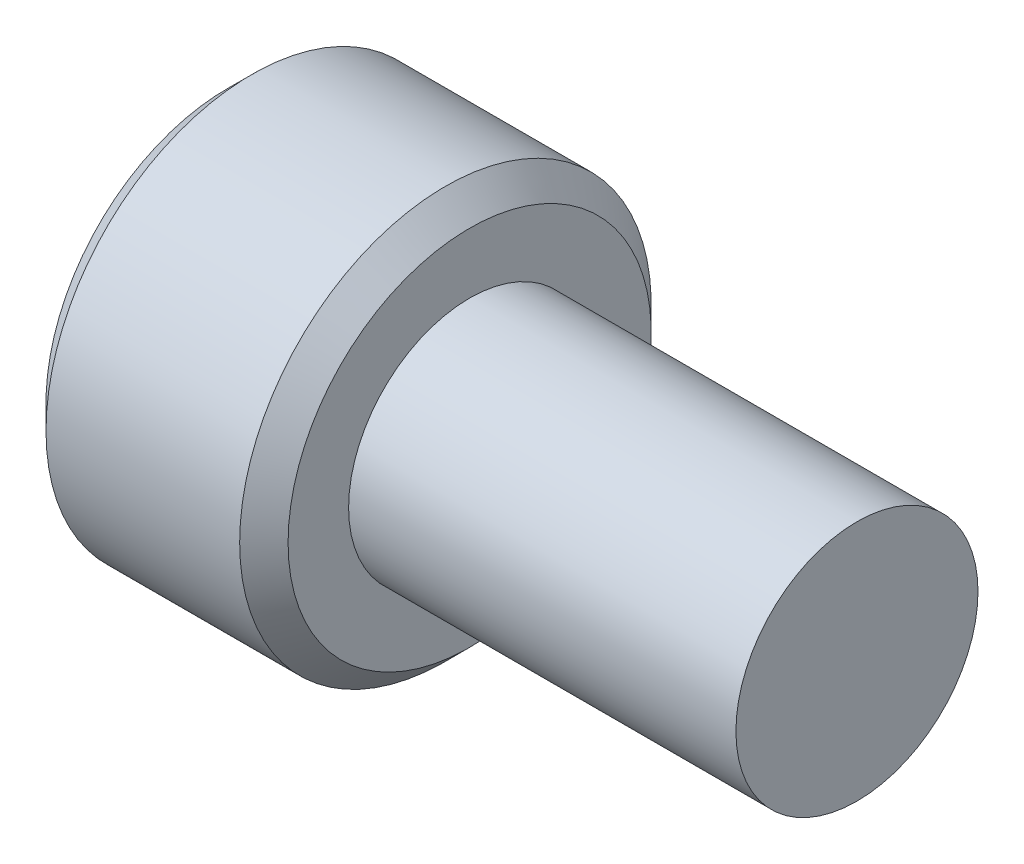
ISO-10303-21;
HEADER;
FILE_DESCRIPTION(('STEP AP214'),'2;1');
FILE_NAME('part.step','',(''),(''),'','','');
FILE_SCHEMA(('AUTOMOTIVE_DESIGN { 1 0 10303 214 1 1 1 1 }'));
ENDSEC;
DATA;
#1=APPLICATION_CONTEXT('core data for automotive mechanical design processes');
#2=APPLICATION_PROTOCOL_DEFINITION('international standard','automotive_design',2000,#1);
#3=PRODUCT_CONTEXT('',#1,'mechanical');
#4=PRODUCT('Part','Part','',(#3));
#5=PRODUCT_RELATED_PRODUCT_CATEGORY('part','',(#4));
#6=PRODUCT_DEFINITION_FORMATION('','',#4);
#7=PRODUCT_DEFINITION_CONTEXT('part definition',#1,'design');
#8=PRODUCT_DEFINITION('design','',#6,#7);
#9=PRODUCT_DEFINITION_SHAPE('','',#8);
#10=(LENGTH_UNIT() NAMED_UNIT(*) SI_UNIT(.MILLI.,.METRE.));
#11=(NAMED_UNIT(*) PLANE_ANGLE_UNIT() SI_UNIT($,.RADIAN.));
#12=(NAMED_UNIT(*) SI_UNIT($,.STERADIAN.) SOLID_ANGLE_UNIT());
#13=UNCERTAINTY_MEASURE_WITH_UNIT(LENGTH_MEASURE(1.E-05),#10,'distance_accuracy_value','');
#14=(GEOMETRIC_REPRESENTATION_CONTEXT(3) GLOBAL_UNCERTAINTY_ASSIGNED_CONTEXT((#13)) GLOBAL_UNIT_ASSIGNED_CONTEXT((#10,
#11,#12)) REPRESENTATION_CONTEXT('',''));
#15=CARTESIAN_POINT('',(0.,0.,0.));
#16=DIRECTION('',(0.,0.,1.));
#17=DIRECTION('',(1.,0.,0.));
#18=AXIS2_PLACEMENT_3D('',#15,#16,#17);
#19=CARTESIAN_POINT('',(-5.,0.,0.));
#20=DIRECTION('',(1.,0.,0.));
#21=DIRECTION('',(0.,0.,-1.));
#22=AXIS2_PLACEMENT_3D('',#19,#20,#21);
#23=PLANE('',#22);
#24=CARTESIAN_POINT('',(-5.,0.,0.));
#25=DIRECTION('',(1.,0.,0.));
#26=DIRECTION('',(0.,0.,-1.));
#27=AXIS2_PLACEMENT_3D('',#24,#25,#26);
#28=CIRCLE('',#27,3.75);
#29=CARTESIAN_POINT('',(-5.,0.,-3.75));
#30=VERTEX_POINT('',#29);
#31=EDGE_CURVE('E11',#30,#30,#28,.F.);
#32=ORIENTED_EDGE('',*,*,#31,.T.);
#33=EDGE_LOOP('',(#32));
#34=FACE_BOUND('',#33,.T.);
#35=DIRECTION('',(0.,0.5,-0.866025403784438));
#36=VECTOR('',#35,1.);
#37=CARTESIAN_POINT('',(-5.,1.15470053837925,2.));
#38=LINE('',#37,#36);
#39=CARTESIAN_POINT('',(-5.,1.15470053837925,2.));
#40=VERTEX_POINT('',#39);
#41=CARTESIAN_POINT('',(-5.,2.3094010767585,0.));
#42=VERTEX_POINT('',#41);
#43=EDGE_CURVE('E149',#40,#42,#38,.T.);
#44=ORIENTED_EDGE('',*,*,#43,.F.);
#45=DIRECTION('',(0.,1.,0.));
#46=VECTOR('',#45,1.);
#47=CARTESIAN_POINT('',(-5.,-1.15470053837925,2.));
#48=LINE('',#47,#46);
#49=CARTESIAN_POINT('',(-5.,-1.15470053837925,2.));
#50=VERTEX_POINT('',#49);
#51=EDGE_CURVE('E122',#50,#40,#48,.T.);
#52=ORIENTED_EDGE('',*,*,#51,.F.);
#53=DIRECTION('',(0.,0.5,0.866025403784439));
#54=VECTOR('',#53,1.);
#55=CARTESIAN_POINT('',(-5.,-2.3094010767585,0.));
#56=LINE('',#55,#54);
#57=CARTESIAN_POINT('',(-5.,-2.3094010767585,0.));
#58=VERTEX_POINT('',#57);
#59=EDGE_CURVE('E118',#58,#50,#56,.T.);
#60=ORIENTED_EDGE('',*,*,#59,.F.);
#61=DIRECTION('',(0.,-0.5,0.866025403784439));
#62=VECTOR('',#61,1.);
#63=CARTESIAN_POINT('',(-5.,-1.15470053837925,-2.));
#64=LINE('',#63,#62);
#65=CARTESIAN_POINT('',(-5.,-1.15470053837925,-2.));
#66=VERTEX_POINT('',#65);
#67=EDGE_CURVE('E155',#66,#58,#64,.T.);
#68=ORIENTED_EDGE('',*,*,#67,.F.);
#69=DIRECTION('',(0.,-1.,0.));
#70=VECTOR('',#69,1.);
#71=CARTESIAN_POINT('',(-5.,1.15470053837925,-2.));
#72=LINE('',#71,#70);
#73=CARTESIAN_POINT('',(-5.,1.15470053837925,-2.));
#74=VERTEX_POINT('',#73);
#75=EDGE_CURVE('E153',#74,#66,#72,.T.);
#76=ORIENTED_EDGE('',*,*,#75,.F.);
#77=DIRECTION('',(0.,-0.5,-0.866025403784439));
#78=VECTOR('',#77,1.);
#79=CARTESIAN_POINT('',(-5.,2.3094010767585,0.));
#80=LINE('',#79,#78);
#81=EDGE_CURVE('E151',#42,#74,#80,.T.);
#82=ORIENTED_EDGE('',*,*,#81,.F.);
#83=EDGE_LOOP('',(#44,#52,#60,#68,#76,#82));
#84=FACE_BOUND('',#83,.T.);
#85=ADVANCED_FACE('F36',(#34,#84),#23,.F.);
#86=CARTESIAN_POINT('',(0.,2.5,0.));
#87=DIRECTION('',(-1.,0.,0.));
#88=DIRECTION('',(0.,0.,1.));
#89=AXIS2_PLACEMENT_3D('',#86,#87,#88);
#90=PLANE('',#89);
#91=CARTESIAN_POINT('',(0.,0.,0.));
#92=DIRECTION('',(-1.,0.,0.));
#93=DIRECTION('',(0.,0.,1.));
#94=AXIS2_PLACEMENT_3D('',#91,#92,#93);
#95=CIRCLE('',#94,3.75);
#96=CARTESIAN_POINT('',(0.,0.,3.75));
#97=VERTEX_POINT('',#96);
#98=EDGE_CURVE('E44',#97,#97,#95,.F.);
#99=ORIENTED_EDGE('',*,*,#98,.T.);
#100=EDGE_LOOP('',(#99));
#101=FACE_BOUND('',#100,.T.);
#102=CARTESIAN_POINT('',(0.,0.,0.));
#103=DIRECTION('',(-1.,0.,0.));
#104=DIRECTION('',(0.,0.,1.));
#105=AXIS2_PLACEMENT_3D('',#102,#103,#104);
#106=CIRCLE('',#105,2.5);
#107=CARTESIAN_POINT('',(0.,0.,2.5));
#108=VERTEX_POINT('',#107);
#109=EDGE_CURVE('E174',#108,#108,#106,.T.);
#110=ORIENTED_EDGE('',*,*,#109,.T.);
#111=EDGE_LOOP('',(#110));
#112=FACE_BOUND('',#111,.T.);
#113=ADVANCED_FACE('F189',(#101,#112),#90,.F.);
#114=CARTESIAN_POINT('',(-10.4,0.,0.));
#115=DIRECTION('',(-1.,0.,0.));
#116=DIRECTION('',(0.,0.,1.));
#117=AXIS2_PLACEMENT_3D('',#114,#115,#116);
#118=CYLINDRICAL_SURFACE('',#117,4.25);
#119=CARTESIAN_POINT('',(-0.5,0.,0.));
#120=DIRECTION('',(-1.,0.,0.));
#121=DIRECTION('',(0.,0.,1.));
#122=AXIS2_PLACEMENT_3D('',#119,#120,#121);
#123=CIRCLE('',#122,4.25);
#124=CARTESIAN_POINT('',(-0.5,0.,4.25));
#125=VERTEX_POINT('',#124);
#126=EDGE_CURVE('E184',#125,#125,#123,.T.);
#127=ORIENTED_EDGE('',*,*,#126,.T.);
#128=EDGE_LOOP('',(#127));
#129=FACE_BOUND('',#128,.T.);
#130=CARTESIAN_POINT('',(-4.5,0.,0.));
#131=DIRECTION('',(1.,0.,0.));
#132=DIRECTION('',(0.,0.,-1.));
#133=AXIS2_PLACEMENT_3D('',#130,#131,#132);
#134=CIRCLE('',#133,4.25);
#135=CARTESIAN_POINT('',(-4.5,0.,-4.25));
#136=VERTEX_POINT('',#135);
#137=EDGE_CURVE('E181',#136,#136,#134,.T.);
#138=ORIENTED_EDGE('',*,*,#137,.T.);
#139=EDGE_LOOP('',(#138));
#140=FACE_BOUND('',#139,.T.);
#141=ADVANCED_FACE('F198',(#129,#140),#118,.T.);
#142=CARTESIAN_POINT('',(8.,2.5,0.));
#143=DIRECTION('',(-1.,0.,0.));
#144=DIRECTION('',(0.,0.,1.));
#145=AXIS2_PLACEMENT_3D('',#142,#143,#144);
#146=PLANE('',#145);
#147=CARTESIAN_POINT('',(8.,0.,0.));
#148=DIRECTION('',(-1.,0.,0.));
#149=DIRECTION('',(0.,0.,1.));
#150=AXIS2_PLACEMENT_3D('',#147,#148,#149);
#151=CIRCLE('',#150,2.5);
#152=CARTESIAN_POINT('',(8.,0.,2.5));
#153=VERTEX_POINT('',#152);
#154=EDGE_CURVE('E178',#153,#153,#151,.T.);
#155=ORIENTED_EDGE('',*,*,#154,.F.);
#156=EDGE_LOOP('',(#155));
#157=FACE_BOUND('',#156,.T.);
#158=ADVANCED_FACE('F201',(#157),#146,.F.);
#159=CARTESIAN_POINT('',(-10.4,0.,0.));
#160=DIRECTION('',(-1.,0.,0.));
#161=DIRECTION('',(0.,0.,1.));
#162=AXIS2_PLACEMENT_3D('',#159,#160,#161);
#163=CYLINDRICAL_SURFACE('',#162,2.5);
#164=ORIENTED_EDGE('',*,*,#109,.F.);
#165=EDGE_LOOP('',(#164));
#166=FACE_BOUND('',#165,.T.);
#167=ORIENTED_EDGE('',*,*,#154,.T.);
#168=EDGE_LOOP('',(#167));
#169=FACE_BOUND('',#168,.T.);
#170=ADVANCED_FACE('F274',(#166,#169),#163,.T.);
#171=CARTESIAN_POINT('',(-3.,-1.15470053837925,2.));
#172=DIRECTION('',(0.,0.,1.));
#173=DIRECTION('',(1.,0.,0.));
#174=AXIS2_PLACEMENT_3D('',#171,#172,#173);
#175=PLANE('',#174);
#176=DIRECTION('',(0.,1.,0.));
#177=VECTOR('',#176,1.);
#178=CARTESIAN_POINT('',(-3.,-1.15470053837925,2.));
#179=LINE('',#178,#177);
#180=CARTESIAN_POINT('',(-3.,-1.15470053837925,2.));
#181=VERTEX_POINT('',#180);
#182=CARTESIAN_POINT('',(-3.,0.,2.));
#183=VERTEX_POINT('',#182);
#184=EDGE_CURVE('E59',#181,#183,#179,.T.);
#185=ORIENTED_EDGE('',*,*,#184,.F.);
#186=DIRECTION('',(-1.,0.,0.));
#187=VECTOR('',#186,1.);
#188=CARTESIAN_POINT('',(-3.,-1.15470053837925,2.));
#189=LINE('',#188,#187);
#190=EDGE_CURVE('E159',#181,#50,#189,.T.);
#191=ORIENTED_EDGE('',*,*,#190,.T.);
#192=ORIENTED_EDGE('',*,*,#51,.T.);
#193=DIRECTION('',(-1.,0.,0.));
#194=VECTOR('',#193,1.);
#195=CARTESIAN_POINT('',(-3.,1.15470053837925,2.));
#196=LINE('',#195,#194);
#197=CARTESIAN_POINT('',(-3.,1.15470053837925,2.));
#198=VERTEX_POINT('',#197);
#199=EDGE_CURVE('E51',#198,#40,#196,.T.);
#200=ORIENTED_EDGE('',*,*,#199,.F.);
#201=EDGE_CURVE('E111',#183,#198,#179,.T.);
#202=ORIENTED_EDGE('',*,*,#201,.F.);
#203=EDGE_LOOP('',(#185,#191,#192,#200,#202));
#204=FACE_BOUND('',#203,.T.);
#205=ADVANCED_FACE('F120',(#204),#175,.F.);
#206=CARTESIAN_POINT('',(-3.,-2.3094010767585,0.));
#207=DIRECTION('',(0.,-0.866025403784439,0.5));
#208=DIRECTION('',(0.,-0.5,-0.866025403784439));
#209=AXIS2_PLACEMENT_3D('',#206,#207,#208);
#210=PLANE('',#209);
#211=DIRECTION('',(0.,0.5,0.866025403784439));
#212=VECTOR('',#211,1.);
#213=CARTESIAN_POINT('',(-3.,-2.3094010767585,0.));
#214=LINE('',#213,#212);
#215=CARTESIAN_POINT('',(-3.,-2.3094010767585,0.));
#216=VERTEX_POINT('',#215);
#217=CARTESIAN_POINT('',(-3.,-1.73205080756888,1.));
#218=VERTEX_POINT('',#217);
#219=EDGE_CURVE('E125',#216,#218,#214,.T.);
#220=ORIENTED_EDGE('',*,*,#219,.F.);
#221=DIRECTION('',(-1.,0.,0.));
#222=VECTOR('',#221,1.);
#223=CARTESIAN_POINT('',(-3.,-2.3094010767585,0.));
#224=LINE('',#223,#222);
#225=EDGE_CURVE('E162',#216,#58,#224,.T.);
#226=ORIENTED_EDGE('',*,*,#225,.T.);
#227=ORIENTED_EDGE('',*,*,#59,.T.);
#228=ORIENTED_EDGE('',*,*,#190,.F.);
#229=EDGE_CURVE('E145',#218,#181,#214,.T.);
#230=ORIENTED_EDGE('',*,*,#229,.F.);
#231=EDGE_LOOP('',(#220,#226,#227,#228,#230));
#232=FACE_BOUND('',#231,.T.);
#233=ADVANCED_FACE('F236',(#232),#210,.F.);
#234=CARTESIAN_POINT('',(-3.,-1.15470053837925,-2.));
#235=DIRECTION('',(0.,-0.866025403784439,-0.5));
#236=DIRECTION('',(0.,0.5,-0.866025403784439));
#237=AXIS2_PLACEMENT_3D('',#234,#235,#236);
#238=PLANE('',#237);
#239=DIRECTION('',(0.,-0.5,0.866025403784439));
#240=VECTOR('',#239,1.);
#241=CARTESIAN_POINT('',(-3.,-1.15470053837925,-2.));
#242=LINE('',#241,#240);
#243=CARTESIAN_POINT('',(-3.,-1.15470053837925,-2.));
#244=VERTEX_POINT('',#243);
#245=CARTESIAN_POINT('',(-3.,-1.73205080756888,-1.));
#246=VERTEX_POINT('',#245);
#247=EDGE_CURVE('E142',#244,#246,#242,.T.);
#248=ORIENTED_EDGE('',*,*,#247,.F.);
#249=DIRECTION('',(-1.,0.,0.));
#250=VECTOR('',#249,1.);
#251=CARTESIAN_POINT('',(-3.,-1.15470053837925,-2.));
#252=LINE('',#251,#250);
#253=EDGE_CURVE('E165',#244,#66,#252,.T.);
#254=ORIENTED_EDGE('',*,*,#253,.T.);
#255=ORIENTED_EDGE('',*,*,#67,.T.);
#256=ORIENTED_EDGE('',*,*,#225,.F.);
#257=EDGE_CURVE('E141',#246,#216,#242,.T.);
#258=ORIENTED_EDGE('',*,*,#257,.F.);
#259=EDGE_LOOP('',(#248,#254,#255,#256,#258));
#260=FACE_BOUND('',#259,.T.);
#261=ADVANCED_FACE('F243',(#260),#238,.F.);
#262=CARTESIAN_POINT('',(-3.,1.15470053837925,-2.));
#263=DIRECTION('',(0.,0.,-1.));
#264=DIRECTION('',(0.,1.,0.));
#265=AXIS2_PLACEMENT_3D('',#262,#263,#264);
#266=PLANE('',#265);
#267=DIRECTION('',(0.,-1.,0.));
#268=VECTOR('',#267,1.);
#269=CARTESIAN_POINT('',(-3.,1.15470053837925,-2.));
#270=LINE('',#269,#268);
#271=CARTESIAN_POINT('',(-3.,1.15470053837925,-2.));
#272=VERTEX_POINT('',#271);
#273=CARTESIAN_POINT('',(-3.,0.,-2.));
#274=VERTEX_POINT('',#273);
#275=EDGE_CURVE('E138',#272,#274,#270,.T.);
#276=ORIENTED_EDGE('',*,*,#275,.F.);
#277=DIRECTION('',(-1.,0.,0.));
#278=VECTOR('',#277,1.);
#279=CARTESIAN_POINT('',(-3.,1.15470053837925,-2.));
#280=LINE('',#279,#278);
#281=EDGE_CURVE('E168',#272,#74,#280,.T.);
#282=ORIENTED_EDGE('',*,*,#281,.T.);
#283=ORIENTED_EDGE('',*,*,#75,.T.);
#284=ORIENTED_EDGE('',*,*,#253,.F.);
#285=EDGE_CURVE('E137',#274,#244,#270,.T.);
#286=ORIENTED_EDGE('',*,*,#285,.F.);
#287=EDGE_LOOP('',(#276,#282,#283,#284,#286));
#288=FACE_BOUND('',#287,.T.);
#289=ADVANCED_FACE('F248',(#288),#266,.F.);
#290=CARTESIAN_POINT('',(-3.,2.3094010767585,0.));
#291=DIRECTION('',(0.,0.866025403784439,-0.5));
#292=DIRECTION('',(0.,0.5,0.866025403784439));
#293=AXIS2_PLACEMENT_3D('',#290,#291,#292);
#294=PLANE('',#293);
#295=DIRECTION('',(0.,-0.5,-0.866025403784439));
#296=VECTOR('',#295,1.);
#297=CARTESIAN_POINT('',(-3.,2.3094010767585,0.));
#298=LINE('',#297,#296);
#299=CARTESIAN_POINT('',(-3.,2.3094010767585,0.));
#300=VERTEX_POINT('',#299);
#301=CARTESIAN_POINT('',(-3.,1.73205080756888,-1.));
#302=VERTEX_POINT('',#301);
#303=EDGE_CURVE('E133',#300,#302,#298,.T.);
#304=ORIENTED_EDGE('',*,*,#303,.F.);
#305=DIRECTION('',(-1.,0.,0.));
#306=VECTOR('',#305,1.);
#307=CARTESIAN_POINT('',(-3.,2.3094010767585,0.));
#308=LINE('',#307,#306);
#309=EDGE_CURVE('E124',#300,#42,#308,.T.);
#310=ORIENTED_EDGE('',*,*,#309,.T.);
#311=ORIENTED_EDGE('',*,*,#81,.T.);
#312=ORIENTED_EDGE('',*,*,#281,.F.);
#313=EDGE_CURVE('E131',#302,#272,#298,.T.);
#314=ORIENTED_EDGE('',*,*,#313,.F.);
#315=EDGE_LOOP('',(#304,#310,#311,#312,#314));
#316=FACE_BOUND('',#315,.T.);
#317=ADVANCED_FACE('F217',(#316),#294,.F.);
#318=CARTESIAN_POINT('',(-3.,1.15470053837925,2.));
#319=DIRECTION('',(0.,0.866025403784439,0.5));
#320=DIRECTION('',(0.,-0.5,0.866025403784439));
#321=AXIS2_PLACEMENT_3D('',#318,#319,#320);
#322=PLANE('',#321);
#323=DIRECTION('',(0.,0.5,-0.866025403784438));
#324=VECTOR('',#323,1.);
#325=CARTESIAN_POINT('',(-3.,1.15470053837925,2.));
#326=LINE('',#325,#324);
#327=CARTESIAN_POINT('',(-3.,1.73205080756888,1.));
#328=VERTEX_POINT('',#327);
#329=EDGE_CURVE('E113',#198,#328,#326,.T.);
#330=ORIENTED_EDGE('',*,*,#329,.F.);
#331=ORIENTED_EDGE('',*,*,#199,.T.);
#332=ORIENTED_EDGE('',*,*,#43,.T.);
#333=ORIENTED_EDGE('',*,*,#309,.F.);
#334=EDGE_CURVE('E130',#328,#300,#326,.T.);
#335=ORIENTED_EDGE('',*,*,#334,.F.);
#336=EDGE_LOOP('',(#330,#331,#332,#333,#335));
#337=FACE_BOUND('',#336,.T.);
#338=ADVANCED_FACE('F128',(#337),#322,.F.);
#339=CARTESIAN_POINT('',(-3.,0.,0.));
#340=DIRECTION('',(-1.,0.,0.));
#341=DIRECTION('',(0.,0.,1.));
#342=AXIS2_PLACEMENT_3D('',#339,#340,#341);
#343=PLANE('',#342);
#344=ORIENTED_EDGE('',*,*,#201,.T.);
#345=ORIENTED_EDGE('',*,*,#329,.T.);
#346=CARTESIAN_POINT('',(-3.,0.,0.));
#347=DIRECTION('',(-1.,0.,0.));
#348=DIRECTION('',(0.,0.,1.));
#349=AXIS2_PLACEMENT_3D('',#346,#347,#348);
#350=CIRCLE('',#349,2.);
#351=EDGE_CURVE('E115',#183,#328,#350,.T.);
#352=ORIENTED_EDGE('',*,*,#351,.F.);
#353=EDGE_LOOP('',(#344,#345,#352));
#354=FACE_BOUND('',#353,.T.);
#355=ADVANCED_FACE('F112',(#354),#343,.T.);
#356=ORIENTED_EDGE('',*,*,#334,.T.);
#357=ORIENTED_EDGE('',*,*,#303,.T.);
#358=EDGE_CURVE('E175',#328,#302,#350,.T.);
#359=ORIENTED_EDGE('',*,*,#358,.F.);
#360=EDGE_LOOP('',(#356,#357,#359));
#361=FACE_BOUND('',#360,.T.);
#362=ADVANCED_FACE('F222',(#361),#343,.T.);
#363=ORIENTED_EDGE('',*,*,#313,.T.);
#364=ORIENTED_EDGE('',*,*,#275,.T.);
#365=EDGE_CURVE('E227',#302,#274,#350,.T.);
#366=ORIENTED_EDGE('',*,*,#365,.F.);
#367=EDGE_LOOP('',(#363,#364,#366));
#368=FACE_BOUND('',#367,.T.);
#369=ADVANCED_FACE('F253',(#368),#343,.T.);
#370=ORIENTED_EDGE('',*,*,#285,.T.);
#371=ORIENTED_EDGE('',*,*,#247,.T.);
#372=EDGE_CURVE('E228',#274,#246,#350,.T.);
#373=ORIENTED_EDGE('',*,*,#372,.F.);
#374=EDGE_LOOP('',(#370,#371,#373));
#375=FACE_BOUND('',#374,.T.);
#376=ADVANCED_FACE('F251',(#375),#343,.T.);
#377=ORIENTED_EDGE('',*,*,#257,.T.);
#378=ORIENTED_EDGE('',*,*,#219,.T.);
#379=EDGE_CURVE('E229',#246,#218,#350,.T.);
#380=ORIENTED_EDGE('',*,*,#379,.F.);
#381=EDGE_LOOP('',(#377,#378,#380));
#382=FACE_BOUND('',#381,.T.);
#383=ADVANCED_FACE('F238',(#382),#343,.T.);
#384=ORIENTED_EDGE('',*,*,#229,.T.);
#385=ORIENTED_EDGE('',*,*,#184,.T.);
#386=EDGE_CURVE('E161',#218,#183,#350,.T.);
#387=ORIENTED_EDGE('',*,*,#386,.F.);
#388=EDGE_LOOP('',(#384,#385,#387));
#389=FACE_BOUND('',#388,.T.);
#390=ADVANCED_FACE('F232',(#389),#343,.T.);
#391=CARTESIAN_POINT('',(-1.79827876194487,0.,0.));
#392=DIRECTION('',(-1.,0.,0.));
#393=DIRECTION('',(0.,0.,1.));
#394=AXIS2_PLACEMENT_3D('',#391,#392,#393);
#395=CONICAL_SURFACE('',#394,0.,1.02974425867665);
#396=ORIENTED_EDGE('',*,*,#351,.T.);
#397=ORIENTED_EDGE('',*,*,#358,.T.);
#398=ORIENTED_EDGE('',*,*,#365,.T.);
#399=ORIENTED_EDGE('',*,*,#372,.T.);
#400=ORIENTED_EDGE('',*,*,#379,.T.);
#401=ORIENTED_EDGE('',*,*,#386,.T.);
#402=EDGE_LOOP('',(#396,#397,#398,#399,#400,#401));
#403=FACE_BOUND('',#402,.T.);
#404=CARTESIAN_POINT('',(-1.79827876194487,0.,0.));
#405=VERTEX_POINT('',#404);
#406=VERTEX_LOOP('',#405);
#407=FACE_BOUND('',#406,.T.);
#408=ADVANCED_FACE('F195',(#403,#407),#395,.F.);
#409=CARTESIAN_POINT('',(-0.5,0.,0.));
#410=DIRECTION('',(-1.,0.,0.));
#411=DIRECTION('',(0.,0.,1.));
#412=AXIS2_PLACEMENT_3D('',#409,#410,#411);
#413=CONICAL_SURFACE('',#412,4.25,0.785398163397448);
#414=ORIENTED_EDGE('',*,*,#98,.F.);
#415=EDGE_LOOP('',(#414));
#416=FACE_BOUND('',#415,.T.);
#417=ORIENTED_EDGE('',*,*,#126,.F.);
#418=EDGE_LOOP('',(#417));
#419=FACE_BOUND('',#418,.T.);
#420=ADVANCED_FACE('F192',(#416,#419),#413,.T.);
#421=CARTESIAN_POINT('',(-5.,0.,0.));
#422=DIRECTION('',(1.,0.,0.));
#423=DIRECTION('',(0.,0.,-1.));
#424=AXIS2_PLACEMENT_3D('',#421,#422,#423);
#425=CONICAL_SURFACE('',#424,3.75,0.785398163397447);
#426=ORIENTED_EDGE('',*,*,#137,.F.);
#427=EDGE_LOOP('',(#426));
#428=FACE_BOUND('',#427,.T.);
#429=ORIENTED_EDGE('',*,*,#31,.F.);
#430=EDGE_LOOP('',(#429));
#431=FACE_BOUND('',#430,.T.);
#432=ADVANCED_FACE('F38',(#428,#431),#425,.T.);
#433=CLOSED_SHELL('',(#85,#113,#141,#158,#170,#205,#233,#261,#289,#317,#338,#355,#362,#369,#376,
#383,#390,#408,#420,#432));
#434=MANIFOLD_SOLID_BREP('B2',#433);
#435=ADVANCED_BREP_SHAPE_REPRESENTATION('',(#18,#434),#14);
#436=SHAPE_DEFINITION_REPRESENTATION(#9,#435);
ENDSEC;
END-ISO-10303-21;
